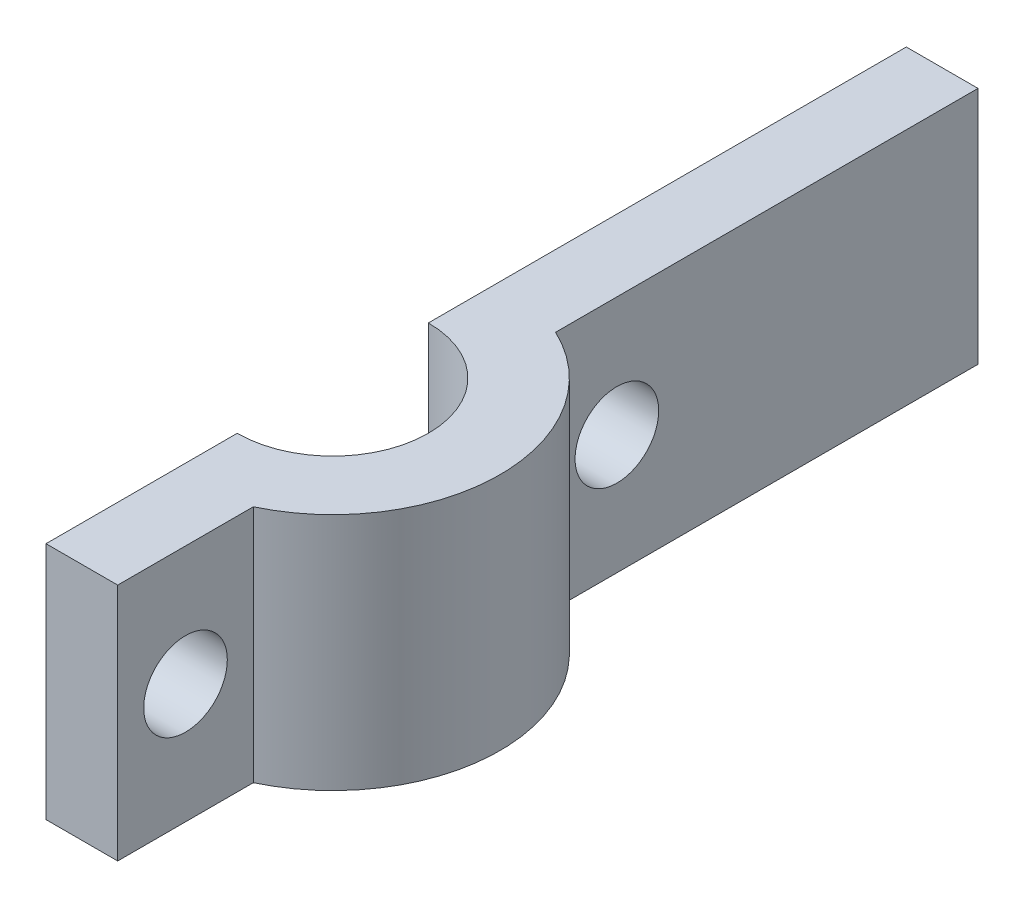
ISO-10303-21;
HEADER;
FILE_DESCRIPTION(('STEP AP214'),'2;1');
FILE_NAME('part.step','',(''),(''),'','','');
FILE_SCHEMA(('AUTOMOTIVE_DESIGN { 1 0 10303 214 1 1 1 1 }'));
ENDSEC;
DATA;
#1=APPLICATION_CONTEXT('core data for automotive mechanical design processes');
#2=APPLICATION_PROTOCOL_DEFINITION('international standard','automotive_design',2000,#1);
#3=PRODUCT_CONTEXT('',#1,'mechanical');
#4=PRODUCT('Part','Part','',(#3));
#5=PRODUCT_RELATED_PRODUCT_CATEGORY('part','',(#4));
#6=PRODUCT_DEFINITION_FORMATION('','',#4);
#7=PRODUCT_DEFINITION_CONTEXT('part definition',#1,'design');
#8=PRODUCT_DEFINITION('design','',#6,#7);
#9=PRODUCT_DEFINITION_SHAPE('','',#8);
#10=(LENGTH_UNIT() NAMED_UNIT(*) SI_UNIT(.MILLI.,.METRE.));
#11=(NAMED_UNIT(*) PLANE_ANGLE_UNIT() SI_UNIT($,.RADIAN.));
#12=(NAMED_UNIT(*) SI_UNIT($,.STERADIAN.) SOLID_ANGLE_UNIT());
#13=UNCERTAINTY_MEASURE_WITH_UNIT(LENGTH_MEASURE(1.E-05),#10,'distance_accuracy_value','');
#14=(GEOMETRIC_REPRESENTATION_CONTEXT(3) GLOBAL_UNCERTAINTY_ASSIGNED_CONTEXT((#13)) GLOBAL_UNIT_ASSIGNED_CONTEXT((#10,
#11,#12)) REPRESENTATION_CONTEXT('',''));
#15=CARTESIAN_POINT('',(0.,0.,0.));
#16=DIRECTION('',(0.,0.,1.));
#17=DIRECTION('',(1.,0.,0.));
#18=AXIS2_PLACEMENT_3D('',#15,#16,#17);
#19=CARTESIAN_POINT('',(3.,10.,-24.));
#20=DIRECTION('',(0.,0.,1.));
#21=DIRECTION('',(1.,0.,0.));
#22=AXIS2_PLACEMENT_3D('',#19,#20,#21);
#23=PLANE('',#22);
#24=DIRECTION('',(-1.,0.,0.));
#25=VECTOR('',#24,1.);
#26=CARTESIAN_POINT('',(3.,0.,-24.));
#27=LINE('',#26,#25);
#28=CARTESIAN_POINT('',(3.,0.,-24.));
#29=VERTEX_POINT('',#28);
#30=CARTESIAN_POINT('',(0.,0.,-24.));
#31=VERTEX_POINT('',#30);
#32=EDGE_CURVE('E130',#29,#31,#27,.T.);
#33=ORIENTED_EDGE('',*,*,#32,.T.);
#34=DIRECTION('',(0.,-1.,0.));
#35=VECTOR('',#34,1.);
#36=CARTESIAN_POINT('',(0.,10.,-24.));
#37=LINE('',#36,#35);
#38=CARTESIAN_POINT('',(0.,10.,-24.));
#39=VERTEX_POINT('',#38);
#40=EDGE_CURVE('E11',#39,#31,#37,.T.);
#41=ORIENTED_EDGE('',*,*,#40,.F.);
#42=DIRECTION('',(-1.,0.,0.));
#43=VECTOR('',#42,1.);
#44=CARTESIAN_POINT('',(3.,10.,-24.));
#45=LINE('',#44,#43);
#46=CARTESIAN_POINT('',(3.,10.,-24.));
#47=VERTEX_POINT('',#46);
#48=EDGE_CURVE('E145',#47,#39,#45,.T.);
#49=ORIENTED_EDGE('',*,*,#48,.F.);
#50=DIRECTION('',(0.,-1.,0.));
#51=VECTOR('',#50,1.);
#52=CARTESIAN_POINT('',(3.,10.,-24.));
#53=LINE('',#52,#51);
#54=EDGE_CURVE('E126',#47,#29,#53,.T.);
#55=ORIENTED_EDGE('',*,*,#54,.T.);
#56=EDGE_LOOP('',(#33,#41,#49,#55));
#57=FACE_BOUND('',#56,.T.);
#58=ADVANCED_FACE('F34',(#57),#23,.F.);
#59=CARTESIAN_POINT('',(0.,10.,-24.));
#60=DIRECTION('',(1.,0.,0.));
#61=DIRECTION('',(0.,0.,-1.));
#62=AXIS2_PLACEMENT_3D('',#59,#60,#61);
#63=PLANE('',#62);
#64=CARTESIAN_POINT('',(0.,5.,-8.88898454581266));
#65=DIRECTION('',(1.,0.,0.));
#66=DIRECTION('',(0.,0.,-1.));
#67=AXIS2_PLACEMENT_3D('',#64,#65,#66);
#68=CIRCLE('',#67,1.75);
#69=CARTESIAN_POINT('',(0.,5.,-10.6389845458127));
#70=VERTEX_POINT('',#69);
#71=EDGE_CURVE('E181',#70,#70,#68,.T.);
#72=ORIENTED_EDGE('',*,*,#71,.T.);
#73=EDGE_LOOP('',(#72));
#74=FACE_BOUND('',#73,.T.);
#75=DIRECTION('',(0.,0.,1.));
#76=VECTOR('',#75,1.);
#77=CARTESIAN_POINT('',(0.,0.,-24.));
#78=LINE('',#77,#76);
#79=CARTESIAN_POINT('',(0.,0.,-4.));
#80=VERTEX_POINT('',#79);
#81=EDGE_CURVE('E133',#31,#80,#78,.T.);
#82=ORIENTED_EDGE('',*,*,#81,.T.);
#83=DIRECTION('',(0.,-1.,0.));
#84=VECTOR('',#83,1.);
#85=CARTESIAN_POINT('',(0.,10.,-4.));
#86=LINE('',#85,#84);
#87=CARTESIAN_POINT('',(0.,10.,-4.));
#88=VERTEX_POINT('',#87);
#89=EDGE_CURVE('E42',#88,#80,#86,.T.);
#90=ORIENTED_EDGE('',*,*,#89,.F.);
#91=DIRECTION('',(0.,0.,1.));
#92=VECTOR('',#91,1.);
#93=CARTESIAN_POINT('',(0.,10.,-24.));
#94=LINE('',#93,#92);
#95=EDGE_CURVE('E93',#39,#88,#94,.T.);
#96=ORIENTED_EDGE('',*,*,#95,.F.);
#97=ORIENTED_EDGE('',*,*,#40,.T.);
#98=EDGE_LOOP('',(#82,#90,#96,#97));
#99=FACE_BOUND('',#98,.T.);
#100=ADVANCED_FACE('F208',(#74,#99),#63,.F.);
#101=CARTESIAN_POINT('',(0.,10.,0.));
#102=DIRECTION('',(0.,-1.,0.));
#103=DIRECTION('',(0.,0.,-1.));
#104=AXIS2_PLACEMENT_3D('',#101,#102,#103);
#105=CYLINDRICAL_SURFACE('',#104,4.);
#106=CARTESIAN_POINT('',(0.,0.,0.));
#107=DIRECTION('',(0.,-1.,0.));
#108=DIRECTION('',(0.,0.,1.));
#109=AXIS2_PLACEMENT_3D('',#106,#107,#108);
#110=CIRCLE('',#109,4.);
#111=CARTESIAN_POINT('',(0.,0.,4.));
#112=VERTEX_POINT('',#111);
#113=EDGE_CURVE('E136',#80,#112,#110,.T.);
#114=ORIENTED_EDGE('',*,*,#113,.T.);
#115=DIRECTION('',(0.,-1.,0.));
#116=VECTOR('',#115,1.);
#117=CARTESIAN_POINT('',(0.,10.,4.));
#118=LINE('',#117,#116);
#119=CARTESIAN_POINT('',(0.,10.,4.));
#120=VERTEX_POINT('',#119);
#121=EDGE_CURVE('E152',#120,#112,#118,.T.);
#122=ORIENTED_EDGE('',*,*,#121,.F.);
#123=CARTESIAN_POINT('',(0.,10.,0.));
#124=DIRECTION('',(0.,-1.,0.));
#125=DIRECTION('',(0.,0.,1.));
#126=AXIS2_PLACEMENT_3D('',#123,#124,#125);
#127=CIRCLE('',#126,4.);
#128=EDGE_CURVE('E160',#88,#120,#127,.T.);
#129=ORIENTED_EDGE('',*,*,#128,.F.);
#130=ORIENTED_EDGE('',*,*,#89,.T.);
#131=EDGE_LOOP('',(#114,#122,#129,#130));
#132=FACE_BOUND('',#131,.T.);
#133=ADVANCED_FACE('F158',(#132),#105,.F.);
#134=CARTESIAN_POINT('',(0.,10.,4.));
#135=DIRECTION('',(1.,0.,0.));
#136=DIRECTION('',(0.,0.,-1.));
#137=AXIS2_PLACEMENT_3D('',#134,#135,#136);
#138=PLANE('',#137);
#139=CARTESIAN_POINT('',(0.,5.,9.16227766016838));
#140=DIRECTION('',(1.,0.,0.));
#141=DIRECTION('',(0.,0.,-1.));
#142=AXIS2_PLACEMENT_3D('',#139,#140,#141);
#143=CIRCLE('',#142,1.75);
#144=CARTESIAN_POINT('',(0.,5.,7.41227766016838));
#145=VERTEX_POINT('',#144);
#146=EDGE_CURVE('E134',#145,#145,#143,.T.);
#147=ORIENTED_EDGE('',*,*,#146,.T.);
#148=EDGE_LOOP('',(#147));
#149=FACE_BOUND('',#148,.T.);
#150=DIRECTION('',(0.,0.,1.));
#151=VECTOR('',#150,1.);
#152=CARTESIAN_POINT('',(0.,0.,4.));
#153=LINE('',#152,#151);
#154=CARTESIAN_POINT('',(0.,0.,12.));
#155=VERTEX_POINT('',#154);
#156=EDGE_CURVE('E138',#112,#155,#153,.T.);
#157=ORIENTED_EDGE('',*,*,#156,.T.);
#158=DIRECTION('',(0.,-1.,0.));
#159=VECTOR('',#158,1.);
#160=CARTESIAN_POINT('',(0.,10.,12.));
#161=LINE('',#160,#159);
#162=CARTESIAN_POINT('',(0.,10.,12.));
#163=VERTEX_POINT('',#162);
#164=EDGE_CURVE('E149',#163,#155,#161,.T.);
#165=ORIENTED_EDGE('',*,*,#164,.F.);
#166=DIRECTION('',(0.,0.,1.));
#167=VECTOR('',#166,1.);
#168=CARTESIAN_POINT('',(0.,10.,4.));
#169=LINE('',#168,#167);
#170=EDGE_CURVE('E172',#120,#163,#169,.T.);
#171=ORIENTED_EDGE('',*,*,#170,.F.);
#172=ORIENTED_EDGE('',*,*,#121,.T.);
#173=EDGE_LOOP('',(#157,#165,#171,#172));
#174=FACE_BOUND('',#173,.T.);
#175=ADVANCED_FACE('F168',(#149,#174),#138,.F.);
#176=CARTESIAN_POINT('',(0.,10.,12.));
#177=DIRECTION('',(0.,0.,-1.));
#178=DIRECTION('',(-1.,0.,0.));
#179=AXIS2_PLACEMENT_3D('',#176,#177,#178);
#180=PLANE('',#179);
#181=DIRECTION('',(1.,0.,0.));
#182=VECTOR('',#181,1.);
#183=CARTESIAN_POINT('',(0.,0.,12.));
#184=LINE('',#183,#182);
#185=CARTESIAN_POINT('',(3.,0.,12.));
#186=VERTEX_POINT('',#185);
#187=EDGE_CURVE('E140',#155,#186,#184,.T.);
#188=ORIENTED_EDGE('',*,*,#187,.T.);
#189=DIRECTION('',(0.,-1.,0.));
#190=VECTOR('',#189,1.);
#191=CARTESIAN_POINT('',(3.,10.,12.));
#192=LINE('',#191,#190);
#193=CARTESIAN_POINT('',(3.,10.,12.));
#194=VERTEX_POINT('',#193);
#195=EDGE_CURVE('E121',#194,#186,#192,.T.);
#196=ORIENTED_EDGE('',*,*,#195,.F.);
#197=DIRECTION('',(1.,0.,0.));
#198=VECTOR('',#197,1.);
#199=CARTESIAN_POINT('',(0.,10.,12.));
#200=LINE('',#199,#198);
#201=EDGE_CURVE('E112',#163,#194,#200,.T.);
#202=ORIENTED_EDGE('',*,*,#201,.F.);
#203=ORIENTED_EDGE('',*,*,#164,.T.);
#204=EDGE_LOOP('',(#188,#196,#202,#203));
#205=FACE_BOUND('',#204,.T.);
#206=ADVANCED_FACE('F171',(#205),#180,.F.);
#207=CARTESIAN_POINT('',(3.,10.,6.32455532033676));
#208=DIRECTION('',(-1.,0.,0.));
#209=DIRECTION('',(0.,0.,1.));
#210=AXIS2_PLACEMENT_3D('',#207,#208,#209);
#211=PLANE('',#210);
#212=CARTESIAN_POINT('',(3.,5.,9.16227766016838));
#213=DIRECTION('',(1.,0.,0.));
#214=DIRECTION('',(0.,0.,-1.));
#215=AXIS2_PLACEMENT_3D('',#212,#213,#214);
#216=CIRCLE('',#215,1.75);
#217=CARTESIAN_POINT('',(3.,5.,7.41227766016838));
#218=VERTEX_POINT('',#217);
#219=EDGE_CURVE('E184',#218,#218,#216,.T.);
#220=ORIENTED_EDGE('',*,*,#219,.F.);
#221=EDGE_LOOP('',(#220));
#222=FACE_BOUND('',#221,.T.);
#223=DIRECTION('',(0.,0.,-1.));
#224=VECTOR('',#223,1.);
#225=CARTESIAN_POINT('',(3.,0.,6.32455532033676));
#226=LINE('',#225,#224);
#227=CARTESIAN_POINT('',(3.,0.,6.32455532033676));
#228=VERTEX_POINT('',#227);
#229=EDGE_CURVE('E120',#186,#228,#226,.T.);
#230=ORIENTED_EDGE('',*,*,#229,.T.);
#231=DIRECTION('',(0.,-1.,0.));
#232=VECTOR('',#231,1.);
#233=CARTESIAN_POINT('',(3.,10.,6.32455532033676));
#234=LINE('',#233,#232);
#235=CARTESIAN_POINT('',(3.,10.,6.32455532033676));
#236=VERTEX_POINT('',#235);
#237=EDGE_CURVE('E117',#236,#228,#234,.T.);
#238=ORIENTED_EDGE('',*,*,#237,.F.);
#239=DIRECTION('',(0.,0.,-1.));
#240=VECTOR('',#239,1.);
#241=CARTESIAN_POINT('',(3.,10.,6.32455532033676));
#242=LINE('',#241,#240);
#243=EDGE_CURVE('E106',#194,#236,#242,.T.);
#244=ORIENTED_EDGE('',*,*,#243,.F.);
#245=ORIENTED_EDGE('',*,*,#195,.T.);
#246=EDGE_LOOP('',(#230,#238,#244,#245));
#247=FACE_BOUND('',#246,.T.);
#248=ADVANCED_FACE('F118',(#222,#247),#211,.F.);
#249=CARTESIAN_POINT('',(0.,10.,0.));
#250=DIRECTION('',(0.,-1.,0.));
#251=DIRECTION('',(0.,0.,-1.));
#252=AXIS2_PLACEMENT_3D('',#249,#250,#251);
#253=CYLINDRICAL_SURFACE('',#252,7.);
#254=CARTESIAN_POINT('',(0.,0.,0.));
#255=DIRECTION('',(0.,1.,0.));
#256=DIRECTION('',(0.,0.,1.));
#257=AXIS2_PLACEMENT_3D('',#254,#255,#256);
#258=CIRCLE('',#257,7.);
#259=CARTESIAN_POINT('',(3.,0.,-6.32455532033676));
#260=VERTEX_POINT('',#259);
#261=EDGE_CURVE('E79',#228,#260,#258,.T.);
#262=ORIENTED_EDGE('',*,*,#261,.T.);
#263=DIRECTION('',(0.,-1.,0.));
#264=VECTOR('',#263,1.);
#265=CARTESIAN_POINT('',(3.,10.,-6.32455532033676));
#266=LINE('',#265,#264);
#267=CARTESIAN_POINT('',(3.,10.,-6.32455532033676));
#268=VERTEX_POINT('',#267);
#269=EDGE_CURVE('E122',#268,#260,#266,.T.);
#270=ORIENTED_EDGE('',*,*,#269,.F.);
#271=CARTESIAN_POINT('',(0.,10.,0.));
#272=DIRECTION('',(0.,1.,0.));
#273=DIRECTION('',(0.,0.,1.));
#274=AXIS2_PLACEMENT_3D('',#271,#272,#273);
#275=CIRCLE('',#274,7.);
#276=EDGE_CURVE('E110',#236,#268,#275,.T.);
#277=ORIENTED_EDGE('',*,*,#276,.F.);
#278=ORIENTED_EDGE('',*,*,#237,.T.);
#279=EDGE_LOOP('',(#262,#270,#277,#278));
#280=FACE_BOUND('',#279,.T.);
#281=ADVANCED_FACE('F124',(#280),#253,.T.);
#282=CARTESIAN_POINT('',(3.,10.,-24.));
#283=DIRECTION('',(-1.,0.,0.));
#284=DIRECTION('',(0.,0.,1.));
#285=AXIS2_PLACEMENT_3D('',#282,#283,#284);
#286=PLANE('',#285);
#287=CARTESIAN_POINT('',(3.,5.,-8.88898454581266));
#288=DIRECTION('',(1.,0.,0.));
#289=DIRECTION('',(0.,0.,-1.));
#290=AXIS2_PLACEMENT_3D('',#287,#288,#289);
#291=CIRCLE('',#290,1.75);
#292=CARTESIAN_POINT('',(3.,5.,-10.6389845458127));
#293=VERTEX_POINT('',#292);
#294=EDGE_CURVE('E178',#293,#293,#291,.T.);
#295=ORIENTED_EDGE('',*,*,#294,.F.);
#296=EDGE_LOOP('',(#295));
#297=FACE_BOUND('',#296,.T.);
#298=DIRECTION('',(0.,0.,-1.));
#299=VECTOR('',#298,1.);
#300=CARTESIAN_POINT('',(3.,0.,-24.));
#301=LINE('',#300,#299);
#302=EDGE_CURVE('E85',#260,#29,#301,.T.);
#303=ORIENTED_EDGE('',*,*,#302,.T.);
#304=ORIENTED_EDGE('',*,*,#54,.F.);
#305=DIRECTION('',(0.,0.,-1.));
#306=VECTOR('',#305,1.);
#307=CARTESIAN_POINT('',(3.,10.,-24.));
#308=LINE('',#307,#306);
#309=EDGE_CURVE('E50',#268,#47,#308,.T.);
#310=ORIENTED_EDGE('',*,*,#309,.F.);
#311=ORIENTED_EDGE('',*,*,#269,.T.);
#312=EDGE_LOOP('',(#303,#304,#310,#311));
#313=FACE_BOUND('',#312,.T.);
#314=ADVANCED_FACE('F204',(#297,#313),#286,.F.);
#315=CARTESIAN_POINT('',(0.,10.,0.));
#316=DIRECTION('',(0.,1.,0.));
#317=DIRECTION('',(0.,0.,1.));
#318=AXIS2_PLACEMENT_3D('',#315,#316,#317);
#319=PLANE('',#318);
#320=ORIENTED_EDGE('',*,*,#48,.T.);
#321=ORIENTED_EDGE('',*,*,#95,.T.);
#322=ORIENTED_EDGE('',*,*,#128,.T.);
#323=ORIENTED_EDGE('',*,*,#170,.T.);
#324=ORIENTED_EDGE('',*,*,#201,.T.);
#325=ORIENTED_EDGE('',*,*,#243,.T.);
#326=ORIENTED_EDGE('',*,*,#276,.T.);
#327=ORIENTED_EDGE('',*,*,#309,.T.);
#328=EDGE_LOOP('',(#320,#321,#322,#323,#324,#325,#326,#327));
#329=FACE_BOUND('',#328,.T.);
#330=ADVANCED_FACE('F108',(#329),#319,.T.);
#331=CARTESIAN_POINT('',(0.,0.,0.));
#332=DIRECTION('',(0.,1.,0.));
#333=DIRECTION('',(0.,0.,1.));
#334=AXIS2_PLACEMENT_3D('',#331,#332,#333);
#335=PLANE('',#334);
#336=ORIENTED_EDGE('',*,*,#32,.F.);
#337=ORIENTED_EDGE('',*,*,#302,.F.);
#338=ORIENTED_EDGE('',*,*,#261,.F.);
#339=ORIENTED_EDGE('',*,*,#229,.F.);
#340=ORIENTED_EDGE('',*,*,#187,.F.);
#341=ORIENTED_EDGE('',*,*,#156,.F.);
#342=ORIENTED_EDGE('',*,*,#113,.F.);
#343=ORIENTED_EDGE('',*,*,#81,.F.);
#344=EDGE_LOOP('',(#336,#337,#338,#339,#340,#341,#342,#343));
#345=FACE_BOUND('',#344,.T.);
#346=ADVANCED_FACE('F164',(#345),#335,.F.);
#347=CARTESIAN_POINT('',(0.,5.,-8.88898454581266));
#348=DIRECTION('',(1.,0.,0.));
#349=DIRECTION('',(0.,0.,-1.));
#350=AXIS2_PLACEMENT_3D('',#347,#348,#349);
#351=CYLINDRICAL_SURFACE('',#350,1.75);
#352=ORIENTED_EDGE('',*,*,#71,.F.);
#353=EDGE_LOOP('',(#352));
#354=FACE_BOUND('',#353,.T.);
#355=ORIENTED_EDGE('',*,*,#294,.T.);
#356=EDGE_LOOP('',(#355));
#357=FACE_BOUND('',#356,.T.);
#358=ADVANCED_FACE('F194',(#354,#357),#351,.F.);
#359=CARTESIAN_POINT('',(0.,5.,9.16227766016838));
#360=DIRECTION('',(1.,0.,0.));
#361=DIRECTION('',(0.,0.,-1.));
#362=AXIS2_PLACEMENT_3D('',#359,#360,#361);
#363=CYLINDRICAL_SURFACE('',#362,1.75);
#364=ORIENTED_EDGE('',*,*,#146,.F.);
#365=EDGE_LOOP('',(#364));
#366=FACE_BOUND('',#365,.T.);
#367=ORIENTED_EDGE('',*,*,#219,.T.);
#368=EDGE_LOOP('',(#367));
#369=FACE_BOUND('',#368,.T.);
#370=ADVANCED_FACE('F191',(#366,#369),#363,.F.);
#371=CLOSED_SHELL('',(#58,#100,#133,#175,#206,#248,#281,#314,#330,#346,#358,#370));
#372=MANIFOLD_SOLID_BREP('B2',#371);
#373=ADVANCED_BREP_SHAPE_REPRESENTATION('',(#18,#372),#14);
#374=SHAPE_DEFINITION_REPRESENTATION(#9,#373);
ENDSEC;
END-ISO-10303-21;
